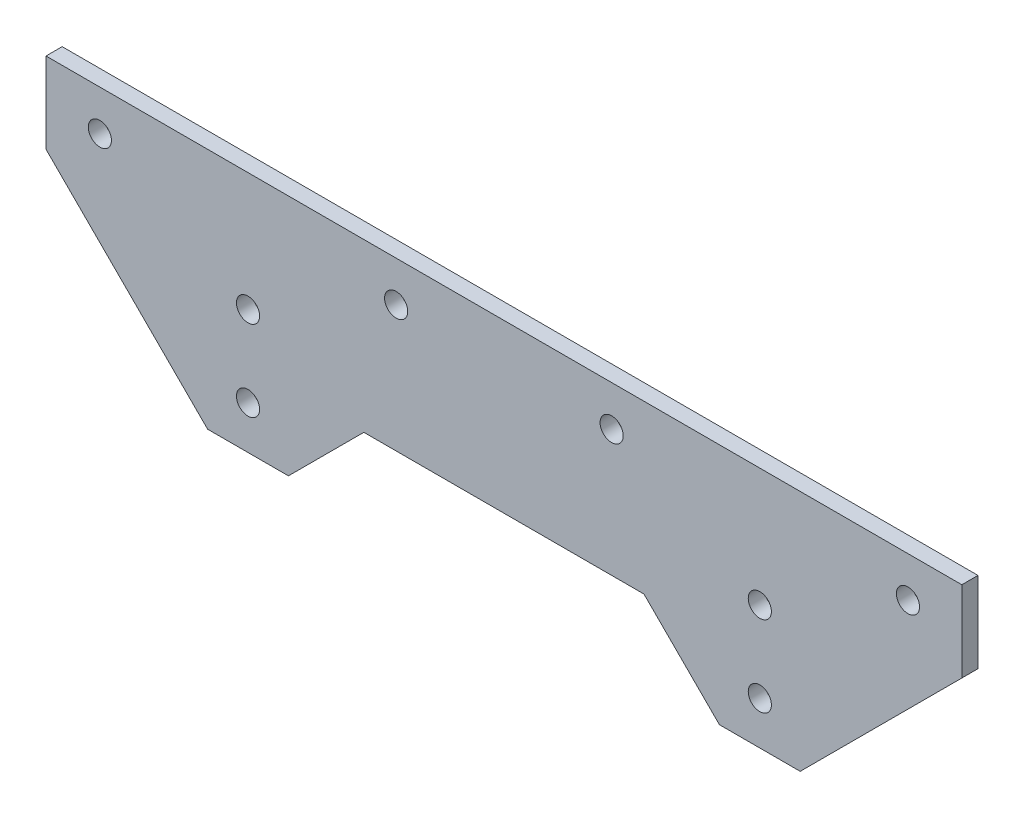
ISO-10303-21;
HEADER;
FILE_DESCRIPTION(('STEP AP214'),'2;1');
FILE_NAME('part.step','',(''),(''),'','','');
FILE_SCHEMA(('AUTOMOTIVE_DESIGN { 1 0 10303 214 1 1 1 1 }'));
ENDSEC;
DATA;
#1=APPLICATION_CONTEXT('core data for automotive mechanical design processes');
#2=APPLICATION_PROTOCOL_DEFINITION('international standard','automotive_design',2000,#1);
#3=PRODUCT_CONTEXT('',#1,'mechanical');
#4=PRODUCT('Part','Part','',(#3));
#5=PRODUCT_RELATED_PRODUCT_CATEGORY('part','',(#4));
#6=PRODUCT_DEFINITION_FORMATION('','',#4);
#7=PRODUCT_DEFINITION_CONTEXT('part definition',#1,'design');
#8=PRODUCT_DEFINITION('design','',#6,#7);
#9=PRODUCT_DEFINITION_SHAPE('','',#8);
#10=(LENGTH_UNIT() NAMED_UNIT(*) SI_UNIT(.MILLI.,.METRE.));
#11=(NAMED_UNIT(*) PLANE_ANGLE_UNIT() SI_UNIT($,.RADIAN.));
#12=(NAMED_UNIT(*) SI_UNIT($,.STERADIAN.) SOLID_ANGLE_UNIT());
#13=UNCERTAINTY_MEASURE_WITH_UNIT(LENGTH_MEASURE(1.E-05),#10,'distance_accuracy_value','');
#14=(GEOMETRIC_REPRESENTATION_CONTEXT(3) GLOBAL_UNCERTAINTY_ASSIGNED_CONTEXT((#13)) GLOBAL_UNIT_ASSIGNED_CONTEXT((#10,
#11,#12)) REPRESENTATION_CONTEXT('',''));
#15=CARTESIAN_POINT('',(0.,0.,0.));
#16=DIRECTION('',(0.,0.,1.));
#17=DIRECTION('',(1.,0.,0.));
#18=AXIS2_PLACEMENT_3D('',#15,#16,#17);
#19=CARTESIAN_POINT('',(0.,0.,3.));
#20=DIRECTION('',(0.,0.,1.));
#21=DIRECTION('',(1.,0.,0.));
#22=AXIS2_PLACEMENT_3D('',#19,#20,#21);
#23=PLANE('',#22);
#24=CARTESIAN_POINT('',(19.9999999999997,218.499923245137,3.));
#25=DIRECTION('',(0.,0.,1.));
#26=DIRECTION('',(-1.,0.,0.));
#27=AXIS2_PLACEMENT_3D('',#24,#25,#26);
#28=CIRCLE('',#27,2.15000000000001);
#29=CARTESIAN_POINT('',(17.8499999999997,218.499923245137,3.));
#30=VERTEX_POINT('',#29);
#31=EDGE_CURVE('E254',#30,#30,#28,.T.);
#32=ORIENTED_EDGE('',*,*,#31,.F.);
#33=EDGE_LOOP('',(#32));
#34=FACE_BOUND('',#33,.T.);
#35=CARTESIAN_POINT('',(47.4999999999961,188.999923245137,3.));
#36=DIRECTION('',(0.,0.,1.));
#37=DIRECTION('',(-1.,0.,0.));
#38=AXIS2_PLACEMENT_3D('',#35,#36,#37);
#39=CIRCLE('',#38,2.15000000000002);
#40=CARTESIAN_POINT('',(45.3499999999961,188.999923245137,3.));
#41=VERTEX_POINT('',#40);
#42=EDGE_CURVE('E242',#41,#41,#39,.T.);
#43=ORIENTED_EDGE('',*,*,#42,.F.);
#44=EDGE_LOOP('',(#43));
#45=FACE_BOUND('',#44,.T.);
#46=CARTESIAN_POINT('',(-74.9999999999968,218.499923245137,3.));
#47=DIRECTION('',(0.,0.,1.));
#48=DIRECTION('',(1.,0.,0.));
#49=AXIS2_PLACEMENT_3D('',#46,#47,#48);
#50=CIRCLE('',#49,2.15);
#51=CARTESIAN_POINT('',(-72.8499999999968,218.499923245137,3.));
#52=VERTEX_POINT('',#51);
#53=EDGE_CURVE('E230',#52,#52,#50,.T.);
#54=ORIENTED_EDGE('',*,*,#53,.F.);
#55=EDGE_LOOP('',(#54));
#56=FACE_BOUND('',#55,.T.);
#57=CARTESIAN_POINT('',(-47.4999999999967,188.999923245137,3.));
#58=DIRECTION('',(0.,0.,1.));
#59=DIRECTION('',(1.,0.,0.));
#60=AXIS2_PLACEMENT_3D('',#57,#58,#59);
#61=CIRCLE('',#60,2.15000000000001);
#62=CARTESIAN_POINT('',(-45.3499999999966,188.999923245137,3.));
#63=VERTEX_POINT('',#62);
#64=EDGE_CURVE('E158',#63,#63,#61,.T.);
#65=ORIENTED_EDGE('',*,*,#64,.F.);
#66=EDGE_LOOP('',(#65));
#67=FACE_BOUND('',#66,.T.);
#68=DIRECTION('',(-1.,0.,0.));
#69=VECTOR('',#68,1.);
#70=CARTESIAN_POINT('',(84.9999999999964,225.999923245137,3.));
#71=LINE('',#70,#69);
#72=CARTESIAN_POINT('',(84.9999999999964,225.999923245137,3.));
#73=VERTEX_POINT('',#72);
#74=CARTESIAN_POINT('',(-84.9999999999969,225.999923245137,3.));
#75=VERTEX_POINT('',#74);
#76=EDGE_CURVE('E173',#73,#75,#71,.T.);
#77=ORIENTED_EDGE('',*,*,#76,.T.);
#78=DIRECTION('',(0.,-1.,0.));
#79=VECTOR('',#78,1.);
#80=CARTESIAN_POINT('',(-84.9999999999969,225.999923245137,3.));
#81=LINE('',#80,#79);
#82=CARTESIAN_POINT('',(-84.9999999999968,210.999923245137,3.));
#83=VERTEX_POINT('',#82);
#84=EDGE_CURVE('E111',#75,#83,#81,.T.);
#85=ORIENTED_EDGE('',*,*,#84,.T.);
#86=DIRECTION('',(0.707106781186549,-0.707106781186545,0.));
#87=VECTOR('',#86,1.);
#88=CARTESIAN_POINT('',(-84.9999999999968,210.999923245137,3.));
#89=LINE('',#88,#87);
#90=CARTESIAN_POINT('',(-54.9999999999967,180.999923245137,3.));
#91=VERTEX_POINT('',#90);
#92=EDGE_CURVE('E194',#83,#91,#89,.T.);
#93=ORIENTED_EDGE('',*,*,#92,.T.);
#94=DIRECTION('',(1.,0.,0.));
#95=VECTOR('',#94,1.);
#96=CARTESIAN_POINT('',(-54.9999999999967,180.999923245137,3.));
#97=LINE('',#96,#95);
#98=CARTESIAN_POINT('',(-39.9999999999967,180.999923245137,3.));
#99=VERTEX_POINT('',#98);
#100=EDGE_CURVE('E213',#91,#99,#97,.T.);
#101=ORIENTED_EDGE('',*,*,#100,.T.);
#102=DIRECTION('',(0.707106781186546,0.707106781186549,0.));
#103=VECTOR('',#102,1.);
#104=CARTESIAN_POINT('',(-39.9999999999967,180.999923245137,3.));
#105=LINE('',#104,#103);
#106=CARTESIAN_POINT('',(-25.9999999999967,194.999923245137,3.));
#107=VERTEX_POINT('',#106);
#108=EDGE_CURVE('E210',#99,#107,#105,.T.);
#109=ORIENTED_EDGE('',*,*,#108,.T.);
#110=DIRECTION('',(1.,0.,0.));
#111=VECTOR('',#110,1.);
#112=CARTESIAN_POINT('',(-25.9999999999967,194.999923245137,3.));
#113=LINE('',#112,#111);
#114=CARTESIAN_POINT('',(25.9999999999962,194.999923245137,3.));
#115=VERTEX_POINT('',#114);
#116=EDGE_CURVE('E212',#107,#115,#113,.T.);
#117=ORIENTED_EDGE('',*,*,#116,.T.);
#118=DIRECTION('',(0.707106781186548,-0.707106781186548,0.));
#119=VECTOR('',#118,1.);
#120=CARTESIAN_POINT('',(25.9999999999962,194.999923245137,3.));
#121=LINE('',#120,#119);
#122=CARTESIAN_POINT('',(39.9999999999963,180.999923245137,3.));
#123=VERTEX_POINT('',#122);
#124=EDGE_CURVE('E136',#115,#123,#121,.T.);
#125=ORIENTED_EDGE('',*,*,#124,.T.);
#126=DIRECTION('',(1.,0.,0.));
#127=VECTOR('',#126,1.);
#128=CARTESIAN_POINT('',(39.9999999999963,180.999923245137,3.));
#129=LINE('',#128,#127);
#130=CARTESIAN_POINT('',(54.9999999999963,180.999923245137,3.));
#131=VERTEX_POINT('',#130);
#132=EDGE_CURVE('E130',#123,#131,#129,.T.);
#133=ORIENTED_EDGE('',*,*,#132,.T.);
#134=DIRECTION('',(0.707106781186547,0.707106781186548,0.));
#135=VECTOR('',#134,1.);
#136=CARTESIAN_POINT('',(54.9999999999963,180.999923245137,3.));
#137=LINE('',#136,#135);
#138=CARTESIAN_POINT('',(84.9999999999963,210.999923245137,3.));
#139=VERTEX_POINT('',#138);
#140=EDGE_CURVE('E134',#131,#139,#137,.T.);
#141=ORIENTED_EDGE('',*,*,#140,.T.);
#142=DIRECTION('',(0.,1.,0.));
#143=VECTOR('',#142,1.);
#144=CARTESIAN_POINT('',(84.9999999999963,210.999923245137,3.));
#145=LINE('',#144,#143);
#146=EDGE_CURVE('E62',#139,#73,#145,.T.);
#147=ORIENTED_EDGE('',*,*,#146,.T.);
#148=EDGE_LOOP('',(#77,#85,#93,#101,#109,#117,#125,#133,#141,#147));
#149=FACE_BOUND('',#148,.T.);
#150=CARTESIAN_POINT('',(-47.4999999999967,203.999923245137,3.));
#151=DIRECTION('',(0.,0.,1.));
#152=DIRECTION('',(1.,0.,0.));
#153=AXIS2_PLACEMENT_3D('',#150,#151,#152);
#154=CIRCLE('',#153,2.15000000000001);
#155=CARTESIAN_POINT('',(-45.3499999999966,203.999923245137,3.));
#156=VERTEX_POINT('',#155);
#157=EDGE_CURVE('E224',#156,#156,#154,.T.);
#158=ORIENTED_EDGE('',*,*,#157,.F.);
#159=EDGE_LOOP('',(#158));
#160=FACE_BOUND('',#159,.T.);
#161=CARTESIAN_POINT('',(-20.0000000000003,218.499923245137,3.));
#162=DIRECTION('',(0.,0.,1.));
#163=DIRECTION('',(1.,0.,0.));
#164=AXIS2_PLACEMENT_3D('',#161,#162,#163);
#165=CIRCLE('',#164,2.15);
#166=CARTESIAN_POINT('',(-17.8500000000003,218.499923245137,3.));
#167=VERTEX_POINT('',#166);
#168=EDGE_CURVE('E236',#167,#167,#165,.T.);
#169=ORIENTED_EDGE('',*,*,#168,.F.);
#170=EDGE_LOOP('',(#169));
#171=FACE_BOUND('',#170,.T.);
#172=CARTESIAN_POINT('',(47.4999999999961,203.999923245137,3.));
#173=DIRECTION('',(0.,0.,1.));
#174=DIRECTION('',(-1.,0.,0.));
#175=AXIS2_PLACEMENT_3D('',#172,#173,#174);
#176=CIRCLE('',#175,2.15);
#177=CARTESIAN_POINT('',(45.3499999999961,203.999923245137,3.));
#178=VERTEX_POINT('',#177);
#179=EDGE_CURVE('E248',#178,#178,#176,.T.);
#180=ORIENTED_EDGE('',*,*,#179,.F.);
#181=EDGE_LOOP('',(#180));
#182=FACE_BOUND('',#181,.T.);
#183=CARTESIAN_POINT('',(74.9999999999962,218.499923245137,3.));
#184=DIRECTION('',(0.,0.,1.));
#185=DIRECTION('',(-1.,0.,0.));
#186=AXIS2_PLACEMENT_3D('',#183,#184,#185);
#187=CIRCLE('',#186,2.15);
#188=CARTESIAN_POINT('',(72.8499999999962,218.499923245137,3.));
#189=VERTEX_POINT('',#188);
#190=EDGE_CURVE('E260',#189,#189,#187,.T.);
#191=ORIENTED_EDGE('',*,*,#190,.F.);
#192=EDGE_LOOP('',(#191));
#193=FACE_BOUND('',#192,.T.);
#194=ADVANCED_FACE('F45',(#34,#45,#56,#67,#149,#160,#171,#182,#193),#23,.T.);
#195=CARTESIAN_POINT('',(0.,0.,0.));
#196=DIRECTION('',(0.,0.,1.));
#197=DIRECTION('',(1.,0.,0.));
#198=AXIS2_PLACEMENT_3D('',#195,#196,#197);
#199=PLANE('',#198);
#200=DIRECTION('',(-1.,0.,0.));
#201=VECTOR('',#200,1.);
#202=CARTESIAN_POINT('',(84.9999999999964,225.999923245137,0.));
#203=LINE('',#202,#201);
#204=CARTESIAN_POINT('',(84.9999999999964,225.999923245137,0.));
#205=VERTEX_POINT('',#204);
#206=CARTESIAN_POINT('',(-84.9999999999969,225.999923245137,0.));
#207=VERTEX_POINT('',#206);
#208=EDGE_CURVE('E154',#205,#207,#203,.T.);
#209=ORIENTED_EDGE('',*,*,#208,.F.);
#210=DIRECTION('',(0.,1.,0.));
#211=VECTOR('',#210,1.);
#212=CARTESIAN_POINT('',(84.9999999999963,210.999923245137,0.));
#213=LINE('',#212,#211);
#214=CARTESIAN_POINT('',(84.9999999999963,210.999923245137,0.));
#215=VERTEX_POINT('',#214);
#216=EDGE_CURVE('E103',#215,#205,#213,.T.);
#217=ORIENTED_EDGE('',*,*,#216,.F.);
#218=DIRECTION('',(0.707106781186547,0.707106781186548,0.));
#219=VECTOR('',#218,1.);
#220=CARTESIAN_POINT('',(54.9999999999963,180.999923245137,0.));
#221=LINE('',#220,#219);
#222=CARTESIAN_POINT('',(54.9999999999963,180.999923245137,0.));
#223=VERTEX_POINT('',#222);
#224=EDGE_CURVE('E97',#223,#215,#221,.T.);
#225=ORIENTED_EDGE('',*,*,#224,.F.);
#226=DIRECTION('',(1.,0.,0.));
#227=VECTOR('',#226,1.);
#228=CARTESIAN_POINT('',(39.9999999999963,180.999923245137,0.));
#229=LINE('',#228,#227);
#230=CARTESIAN_POINT('',(39.9999999999963,180.999923245137,0.));
#231=VERTEX_POINT('',#230);
#232=EDGE_CURVE('E144',#231,#223,#229,.T.);
#233=ORIENTED_EDGE('',*,*,#232,.F.);
#234=DIRECTION('',(0.707106781186548,-0.707106781186548,0.));
#235=VECTOR('',#234,1.);
#236=CARTESIAN_POINT('',(25.9999999999962,194.999923245137,0.));
#237=LINE('',#236,#235);
#238=CARTESIAN_POINT('',(25.9999999999962,194.999923245137,0.));
#239=VERTEX_POINT('',#238);
#240=EDGE_CURVE('E168',#239,#231,#237,.T.);
#241=ORIENTED_EDGE('',*,*,#240,.F.);
#242=DIRECTION('',(1.,0.,0.));
#243=VECTOR('',#242,1.);
#244=CARTESIAN_POINT('',(-25.9999999999967,194.999923245137,0.));
#245=LINE('',#244,#243);
#246=CARTESIAN_POINT('',(-25.9999999999967,194.999923245137,0.));
#247=VERTEX_POINT('',#246);
#248=EDGE_CURVE('E166',#247,#239,#245,.T.);
#249=ORIENTED_EDGE('',*,*,#248,.F.);
#250=DIRECTION('',(0.707106781186546,0.707106781186549,0.));
#251=VECTOR('',#250,1.);
#252=CARTESIAN_POINT('',(-39.9999999999967,180.999923245137,0.));
#253=LINE('',#252,#251);
#254=CARTESIAN_POINT('',(-39.9999999999967,180.999923245137,0.));
#255=VERTEX_POINT('',#254);
#256=EDGE_CURVE('E164',#255,#247,#253,.T.);
#257=ORIENTED_EDGE('',*,*,#256,.F.);
#258=DIRECTION('',(1.,0.,0.));
#259=VECTOR('',#258,1.);
#260=CARTESIAN_POINT('',(-54.9999999999967,180.999923245137,0.));
#261=LINE('',#260,#259);
#262=CARTESIAN_POINT('',(-54.9999999999967,180.999923245137,0.));
#263=VERTEX_POINT('',#262);
#264=EDGE_CURVE('E162',#263,#255,#261,.T.);
#265=ORIENTED_EDGE('',*,*,#264,.F.);
#266=DIRECTION('',(0.707106781186549,-0.707106781186545,0.));
#267=VECTOR('',#266,1.);
#268=CARTESIAN_POINT('',(-84.9999999999968,210.999923245137,0.));
#269=LINE('',#268,#267);
#270=CARTESIAN_POINT('',(-84.9999999999968,210.999923245137,0.));
#271=VERTEX_POINT('',#270);
#272=EDGE_CURVE('E160',#271,#263,#269,.T.);
#273=ORIENTED_EDGE('',*,*,#272,.F.);
#274=DIRECTION('',(0.,-1.,0.));
#275=VECTOR('',#274,1.);
#276=CARTESIAN_POINT('',(-84.9999999999969,225.999923245137,0.));
#277=LINE('',#276,#275);
#278=EDGE_CURVE('E157',#207,#271,#277,.T.);
#279=ORIENTED_EDGE('',*,*,#278,.F.);
#280=EDGE_LOOP('',(#209,#217,#225,#233,#241,#249,#257,#265,#273,#279));
#281=FACE_BOUND('',#280,.T.);
#282=CARTESIAN_POINT('',(-47.4999999999967,188.999923245137,0.));
#283=DIRECTION('',(0.,0.,1.));
#284=DIRECTION('',(1.,0.,0.));
#285=AXIS2_PLACEMENT_3D('',#282,#283,#284);
#286=CIRCLE('',#285,2.15000000000001);
#287=CARTESIAN_POINT('',(-45.3499999999966,188.999923245137,0.));
#288=VERTEX_POINT('',#287);
#289=EDGE_CURVE('E221',#288,#288,#286,.T.);
#290=ORIENTED_EDGE('',*,*,#289,.T.);
#291=EDGE_LOOP('',(#290));
#292=FACE_BOUND('',#291,.T.);
#293=CARTESIAN_POINT('',(-47.4999999999967,203.999923245137,0.));
#294=DIRECTION('',(0.,0.,1.));
#295=DIRECTION('',(1.,0.,0.));
#296=AXIS2_PLACEMENT_3D('',#293,#294,#295);
#297=CIRCLE('',#296,2.15000000000001);
#298=CARTESIAN_POINT('',(-45.3499999999966,203.999923245137,0.));
#299=VERTEX_POINT('',#298);
#300=EDGE_CURVE('E227',#299,#299,#297,.T.);
#301=ORIENTED_EDGE('',*,*,#300,.T.);
#302=EDGE_LOOP('',(#301));
#303=FACE_BOUND('',#302,.T.);
#304=CARTESIAN_POINT('',(-74.9999999999968,218.499923245137,0.));
#305=DIRECTION('',(0.,0.,1.));
#306=DIRECTION('',(1.,0.,0.));
#307=AXIS2_PLACEMENT_3D('',#304,#305,#306);
#308=CIRCLE('',#307,2.15);
#309=CARTESIAN_POINT('',(-72.8499999999968,218.499923245137,0.));
#310=VERTEX_POINT('',#309);
#311=EDGE_CURVE('E233',#310,#310,#308,.T.);
#312=ORIENTED_EDGE('',*,*,#311,.T.);
#313=EDGE_LOOP('',(#312));
#314=FACE_BOUND('',#313,.T.);
#315=CARTESIAN_POINT('',(-20.0000000000003,218.499923245137,0.));
#316=DIRECTION('',(0.,0.,1.));
#317=DIRECTION('',(1.,0.,0.));
#318=AXIS2_PLACEMENT_3D('',#315,#316,#317);
#319=CIRCLE('',#318,2.15);
#320=CARTESIAN_POINT('',(-17.8500000000003,218.499923245137,0.));
#321=VERTEX_POINT('',#320);
#322=EDGE_CURVE('E239',#321,#321,#319,.T.);
#323=ORIENTED_EDGE('',*,*,#322,.T.);
#324=EDGE_LOOP('',(#323));
#325=FACE_BOUND('',#324,.T.);
#326=CARTESIAN_POINT('',(47.4999999999961,188.999923245137,0.));
#327=DIRECTION('',(0.,0.,1.));
#328=DIRECTION('',(-1.,0.,0.));
#329=AXIS2_PLACEMENT_3D('',#326,#327,#328);
#330=CIRCLE('',#329,2.15000000000002);
#331=CARTESIAN_POINT('',(45.3499999999961,188.999923245137,0.));
#332=VERTEX_POINT('',#331);
#333=EDGE_CURVE('E245',#332,#332,#330,.T.);
#334=ORIENTED_EDGE('',*,*,#333,.T.);
#335=EDGE_LOOP('',(#334));
#336=FACE_BOUND('',#335,.T.);
#337=CARTESIAN_POINT('',(47.4999999999961,203.999923245137,0.));
#338=DIRECTION('',(0.,0.,1.));
#339=DIRECTION('',(-1.,0.,0.));
#340=AXIS2_PLACEMENT_3D('',#337,#338,#339);
#341=CIRCLE('',#340,2.15);
#342=CARTESIAN_POINT('',(45.3499999999961,203.999923245137,0.));
#343=VERTEX_POINT('',#342);
#344=EDGE_CURVE('E251',#343,#343,#341,.T.);
#345=ORIENTED_EDGE('',*,*,#344,.T.);
#346=EDGE_LOOP('',(#345));
#347=FACE_BOUND('',#346,.T.);
#348=CARTESIAN_POINT('',(19.9999999999997,218.499923245137,0.));
#349=DIRECTION('',(0.,0.,1.));
#350=DIRECTION('',(-1.,0.,0.));
#351=AXIS2_PLACEMENT_3D('',#348,#349,#350);
#352=CIRCLE('',#351,2.15000000000001);
#353=CARTESIAN_POINT('',(17.8499999999997,218.499923245137,0.));
#354=VERTEX_POINT('',#353);
#355=EDGE_CURVE('E257',#354,#354,#352,.T.);
#356=ORIENTED_EDGE('',*,*,#355,.T.);
#357=EDGE_LOOP('',(#356));
#358=FACE_BOUND('',#357,.T.);
#359=CARTESIAN_POINT('',(74.9999999999962,218.499923245137,0.));
#360=DIRECTION('',(0.,0.,1.));
#361=DIRECTION('',(-1.,0.,0.));
#362=AXIS2_PLACEMENT_3D('',#359,#360,#361);
#363=CIRCLE('',#362,2.15);
#364=CARTESIAN_POINT('',(72.8499999999962,218.499923245137,0.));
#365=VERTEX_POINT('',#364);
#366=EDGE_CURVE('E263',#365,#365,#363,.T.);
#367=ORIENTED_EDGE('',*,*,#366,.T.);
#368=EDGE_LOOP('',(#367));
#369=FACE_BOUND('',#368,.T.);
#370=ADVANCED_FACE('F198',(#281,#292,#303,#314,#325,#336,#347,#358,#369),#199,.F.);
#371=CARTESIAN_POINT('',(84.9999999999964,225.999923245137,3.));
#372=DIRECTION('',(0.,-1.,0.));
#373=DIRECTION('',(0.,0.,-1.));
#374=AXIS2_PLACEMENT_3D('',#371,#372,#373);
#375=PLANE('',#374);
#376=ORIENTED_EDGE('',*,*,#208,.T.);
#377=DIRECTION('',(0.,0.,-1.));
#378=VECTOR('',#377,1.);
#379=CARTESIAN_POINT('',(-84.9999999999969,225.999923245137,3.));
#380=LINE('',#379,#378);
#381=EDGE_CURVE('E13',#75,#207,#380,.T.);
#382=ORIENTED_EDGE('',*,*,#381,.F.);
#383=ORIENTED_EDGE('',*,*,#76,.F.);
#384=DIRECTION('',(0.,0.,-1.));
#385=VECTOR('',#384,1.);
#386=CARTESIAN_POINT('',(84.9999999999964,225.999923245137,3.));
#387=LINE('',#386,#385);
#388=EDGE_CURVE('E150',#73,#205,#387,.T.);
#389=ORIENTED_EDGE('',*,*,#388,.T.);
#390=EDGE_LOOP('',(#376,#382,#383,#389));
#391=FACE_BOUND('',#390,.T.);
#392=ADVANCED_FACE('F47',(#391),#375,.F.);
#393=CARTESIAN_POINT('',(-84.9999999999969,225.999923245137,3.));
#394=DIRECTION('',(1.,0.,0.));
#395=DIRECTION('',(0.,1.,0.));
#396=AXIS2_PLACEMENT_3D('',#393,#394,#395);
#397=PLANE('',#396);
#398=ORIENTED_EDGE('',*,*,#278,.T.);
#399=DIRECTION('',(0.,0.,-1.));
#400=VECTOR('',#399,1.);
#401=CARTESIAN_POINT('',(-84.9999999999968,210.999923245137,3.));
#402=LINE('',#401,#400);
#403=EDGE_CURVE('E54',#83,#271,#402,.T.);
#404=ORIENTED_EDGE('',*,*,#403,.F.);
#405=ORIENTED_EDGE('',*,*,#84,.F.);
#406=ORIENTED_EDGE('',*,*,#381,.T.);
#407=EDGE_LOOP('',(#398,#404,#405,#406));
#408=FACE_BOUND('',#407,.T.);
#409=ADVANCED_FACE('F305',(#408),#397,.F.);
#410=CARTESIAN_POINT('',(-84.9999999999968,210.999923245137,3.));
#411=DIRECTION('',(0.707106781186546,0.70710678118655,0.));
#412=DIRECTION('',(-0.70710678118655,0.707106781186546,0.));
#413=AXIS2_PLACEMENT_3D('',#410,#411,#412);
#414=PLANE('',#413);
#415=ORIENTED_EDGE('',*,*,#272,.T.);
#416=DIRECTION('',(0.,0.,-1.));
#417=VECTOR('',#416,1.);
#418=CARTESIAN_POINT('',(-54.9999999999967,180.999923245137,3.));
#419=LINE('',#418,#417);
#420=EDGE_CURVE('E186',#91,#263,#419,.T.);
#421=ORIENTED_EDGE('',*,*,#420,.F.);
#422=ORIENTED_EDGE('',*,*,#92,.F.);
#423=ORIENTED_EDGE('',*,*,#403,.T.);
#424=EDGE_LOOP('',(#415,#421,#422,#423));
#425=FACE_BOUND('',#424,.T.);
#426=ADVANCED_FACE('F192',(#425),#414,.F.);
#427=CARTESIAN_POINT('',(-54.9999999999967,180.999923245137,3.));
#428=DIRECTION('',(0.,1.,0.));
#429=DIRECTION('',(0.,0.,1.));
#430=AXIS2_PLACEMENT_3D('',#427,#428,#429);
#431=PLANE('',#430);
#432=ORIENTED_EDGE('',*,*,#264,.T.);
#433=DIRECTION('',(0.,0.,-1.));
#434=VECTOR('',#433,1.);
#435=CARTESIAN_POINT('',(-39.9999999999967,180.999923245137,3.));
#436=LINE('',#435,#434);
#437=EDGE_CURVE('E183',#99,#255,#436,.T.);
#438=ORIENTED_EDGE('',*,*,#437,.F.);
#439=ORIENTED_EDGE('',*,*,#100,.F.);
#440=ORIENTED_EDGE('',*,*,#420,.T.);
#441=EDGE_LOOP('',(#432,#438,#439,#440));
#442=FACE_BOUND('',#441,.T.);
#443=ADVANCED_FACE('F204',(#442),#431,.F.);
#444=CARTESIAN_POINT('',(-39.9999999999967,180.999923245137,3.));
#445=DIRECTION('',(-0.707106781186549,0.707106781186546,0.));
#446=DIRECTION('',(-0.707106781186546,-0.707106781186549,0.));
#447=AXIS2_PLACEMENT_3D('',#444,#445,#446);
#448=PLANE('',#447);
#449=ORIENTED_EDGE('',*,*,#256,.T.);
#450=DIRECTION('',(0.,0.,-1.));
#451=VECTOR('',#450,1.);
#452=CARTESIAN_POINT('',(-25.9999999999967,194.999923245137,3.));
#453=LINE('',#452,#451);
#454=EDGE_CURVE('E180',#107,#247,#453,.T.);
#455=ORIENTED_EDGE('',*,*,#454,.F.);
#456=ORIENTED_EDGE('',*,*,#108,.F.);
#457=ORIENTED_EDGE('',*,*,#437,.T.);
#458=EDGE_LOOP('',(#449,#455,#456,#457));
#459=FACE_BOUND('',#458,.T.);
#460=ADVANCED_FACE('F208',(#459),#448,.F.);
#461=CARTESIAN_POINT('',(-25.9999999999967,194.999923245137,3.));
#462=DIRECTION('',(0.,1.,0.));
#463=DIRECTION('',(0.,0.,1.));
#464=AXIS2_PLACEMENT_3D('',#461,#462,#463);
#465=PLANE('',#464);
#466=ORIENTED_EDGE('',*,*,#248,.T.);
#467=DIRECTION('',(0.,0.,-1.));
#468=VECTOR('',#467,1.);
#469=CARTESIAN_POINT('',(25.9999999999962,194.999923245137,3.));
#470=LINE('',#469,#468);
#471=EDGE_CURVE('E177',#115,#239,#470,.T.);
#472=ORIENTED_EDGE('',*,*,#471,.F.);
#473=ORIENTED_EDGE('',*,*,#116,.F.);
#474=ORIENTED_EDGE('',*,*,#454,.T.);
#475=EDGE_LOOP('',(#466,#472,#473,#474));
#476=FACE_BOUND('',#475,.T.);
#477=ADVANCED_FACE('F295',(#476),#465,.F.);
#478=CARTESIAN_POINT('',(25.9999999999962,194.999923245137,3.));
#479=DIRECTION('',(0.707106781186547,0.707106781186547,0.));
#480=DIRECTION('',(-0.707106781186548,0.707106781186548,0.));
#481=AXIS2_PLACEMENT_3D('',#478,#479,#480);
#482=PLANE('',#481);
#483=ORIENTED_EDGE('',*,*,#240,.T.);
#484=DIRECTION('',(0.,0.,-1.));
#485=VECTOR('',#484,1.);
#486=CARTESIAN_POINT('',(39.9999999999963,180.999923245137,3.));
#487=LINE('',#486,#485);
#488=EDGE_CURVE('E145',#123,#231,#487,.T.);
#489=ORIENTED_EDGE('',*,*,#488,.F.);
#490=ORIENTED_EDGE('',*,*,#124,.F.);
#491=ORIENTED_EDGE('',*,*,#471,.T.);
#492=EDGE_LOOP('',(#483,#489,#490,#491));
#493=FACE_BOUND('',#492,.T.);
#494=ADVANCED_FACE('F292',(#493),#482,.F.);
#495=CARTESIAN_POINT('',(39.9999999999963,180.999923245137,3.));
#496=DIRECTION('',(0.,1.,0.));
#497=DIRECTION('',(0.,0.,1.));
#498=AXIS2_PLACEMENT_3D('',#495,#496,#497);
#499=PLANE('',#498);
#500=ORIENTED_EDGE('',*,*,#232,.T.);
#501=DIRECTION('',(0.,0.,-1.));
#502=VECTOR('',#501,1.);
#503=CARTESIAN_POINT('',(54.9999999999963,180.999923245137,3.));
#504=LINE('',#503,#502);
#505=EDGE_CURVE('E141',#131,#223,#504,.T.);
#506=ORIENTED_EDGE('',*,*,#505,.F.);
#507=ORIENTED_EDGE('',*,*,#132,.F.);
#508=ORIENTED_EDGE('',*,*,#488,.T.);
#509=EDGE_LOOP('',(#500,#506,#507,#508));
#510=FACE_BOUND('',#509,.T.);
#511=ADVANCED_FACE('F142',(#510),#499,.F.);
#512=CARTESIAN_POINT('',(54.9999999999963,180.999923245137,3.));
#513=DIRECTION('',(-0.707106781186548,0.707106781186547,0.));
#514=DIRECTION('',(-0.707106781186547,-0.707106781186548,0.));
#515=AXIS2_PLACEMENT_3D('',#512,#513,#514);
#516=PLANE('',#515);
#517=ORIENTED_EDGE('',*,*,#224,.T.);
#518=DIRECTION('',(0.,0.,-1.));
#519=VECTOR('',#518,1.);
#520=CARTESIAN_POINT('',(84.9999999999963,210.999923245137,3.));
#521=LINE('',#520,#519);
#522=EDGE_CURVE('E146',#139,#215,#521,.T.);
#523=ORIENTED_EDGE('',*,*,#522,.F.);
#524=ORIENTED_EDGE('',*,*,#140,.F.);
#525=ORIENTED_EDGE('',*,*,#505,.T.);
#526=EDGE_LOOP('',(#517,#523,#524,#525));
#527=FACE_BOUND('',#526,.T.);
#528=ADVANCED_FACE('F148',(#527),#516,.F.);
#529=CARTESIAN_POINT('',(84.9999999999963,210.999923245137,3.));
#530=DIRECTION('',(-1.,0.,0.));
#531=DIRECTION('',(0.,-1.,0.));
#532=AXIS2_PLACEMENT_3D('',#529,#530,#531);
#533=PLANE('',#532);
#534=ORIENTED_EDGE('',*,*,#216,.T.);
#535=ORIENTED_EDGE('',*,*,#388,.F.);
#536=ORIENTED_EDGE('',*,*,#146,.F.);
#537=ORIENTED_EDGE('',*,*,#522,.T.);
#538=EDGE_LOOP('',(#534,#535,#536,#537));
#539=FACE_BOUND('',#538,.T.);
#540=ADVANCED_FACE('F285',(#539),#533,.F.);
#541=CARTESIAN_POINT('',(-47.4999999999967,188.999923245137,3.));
#542=DIRECTION('',(0.,0.,-1.));
#543=DIRECTION('',(-1.,0.,0.));
#544=AXIS2_PLACEMENT_3D('',#541,#542,#543);
#545=CYLINDRICAL_SURFACE('',#544,2.15000000000001);
#546=ORIENTED_EDGE('',*,*,#64,.T.);
#547=EDGE_LOOP('',(#546));
#548=FACE_BOUND('',#547,.T.);
#549=ORIENTED_EDGE('',*,*,#289,.F.);
#550=EDGE_LOOP('',(#549));
#551=FACE_BOUND('',#550,.T.);
#552=ADVANCED_FACE('F282',(#548,#551),#545,.F.);
#553=CARTESIAN_POINT('',(-47.4999999999967,203.999923245137,3.));
#554=DIRECTION('',(0.,0.,-1.));
#555=DIRECTION('',(-1.,0.,0.));
#556=AXIS2_PLACEMENT_3D('',#553,#554,#555);
#557=CYLINDRICAL_SURFACE('',#556,2.15000000000001);
#558=ORIENTED_EDGE('',*,*,#157,.T.);
#559=EDGE_LOOP('',(#558));
#560=FACE_BOUND('',#559,.T.);
#561=ORIENTED_EDGE('',*,*,#300,.F.);
#562=EDGE_LOOP('',(#561));
#563=FACE_BOUND('',#562,.T.);
#564=ADVANCED_FACE('F381',(#560,#563),#557,.F.);
#565=CARTESIAN_POINT('',(-74.9999999999968,218.499923245137,3.));
#566=DIRECTION('',(0.,0.,-1.));
#567=DIRECTION('',(-1.,0.,0.));
#568=AXIS2_PLACEMENT_3D('',#565,#566,#567);
#569=CYLINDRICAL_SURFACE('',#568,2.15);
#570=ORIENTED_EDGE('',*,*,#53,.T.);
#571=EDGE_LOOP('',(#570));
#572=FACE_BOUND('',#571,.T.);
#573=ORIENTED_EDGE('',*,*,#311,.F.);
#574=EDGE_LOOP('',(#573));
#575=FACE_BOUND('',#574,.T.);
#576=ADVANCED_FACE('F389',(#572,#575),#569,.F.);
#577=CARTESIAN_POINT('',(-20.0000000000003,218.499923245137,3.));
#578=DIRECTION('',(0.,0.,-1.));
#579=DIRECTION('',(-1.,0.,0.));
#580=AXIS2_PLACEMENT_3D('',#577,#578,#579);
#581=CYLINDRICAL_SURFACE('',#580,2.15);
#582=ORIENTED_EDGE('',*,*,#168,.T.);
#583=EDGE_LOOP('',(#582));
#584=FACE_BOUND('',#583,.T.);
#585=ORIENTED_EDGE('',*,*,#322,.F.);
#586=EDGE_LOOP('',(#585));
#587=FACE_BOUND('',#586,.T.);
#588=ADVANCED_FACE('F397',(#584,#587),#581,.F.);
#589=CARTESIAN_POINT('',(47.4999999999961,188.999923245137,3.));
#590=DIRECTION('',(0.,0.,-1.));
#591=DIRECTION('',(-1.,0.,0.));
#592=AXIS2_PLACEMENT_3D('',#589,#590,#591);
#593=CYLINDRICAL_SURFACE('',#592,2.15000000000002);
#594=ORIENTED_EDGE('',*,*,#42,.T.);
#595=EDGE_LOOP('',(#594));
#596=FACE_BOUND('',#595,.T.);
#597=ORIENTED_EDGE('',*,*,#333,.F.);
#598=EDGE_LOOP('',(#597));
#599=FACE_BOUND('',#598,.T.);
#600=ADVANCED_FACE('F406',(#596,#599),#593,.F.);
#601=CARTESIAN_POINT('',(47.4999999999961,203.999923245137,3.));
#602=DIRECTION('',(0.,0.,-1.));
#603=DIRECTION('',(-1.,0.,0.));
#604=AXIS2_PLACEMENT_3D('',#601,#602,#603);
#605=CYLINDRICAL_SURFACE('',#604,2.15);
#606=ORIENTED_EDGE('',*,*,#179,.T.);
#607=EDGE_LOOP('',(#606));
#608=FACE_BOUND('',#607,.T.);
#609=ORIENTED_EDGE('',*,*,#344,.F.);
#610=EDGE_LOOP('',(#609));
#611=FACE_BOUND('',#610,.T.);
#612=ADVANCED_FACE('F415',(#608,#611),#605,.F.);
#613=CARTESIAN_POINT('',(19.9999999999997,218.499923245137,3.));
#614=DIRECTION('',(0.,0.,-1.));
#615=DIRECTION('',(-1.,0.,0.));
#616=AXIS2_PLACEMENT_3D('',#613,#614,#615);
#617=CYLINDRICAL_SURFACE('',#616,2.15000000000001);
#618=ORIENTED_EDGE('',*,*,#31,.T.);
#619=EDGE_LOOP('',(#618));
#620=FACE_BOUND('',#619,.T.);
#621=ORIENTED_EDGE('',*,*,#355,.F.);
#622=EDGE_LOOP('',(#621));
#623=FACE_BOUND('',#622,.T.);
#624=ADVANCED_FACE('F424',(#620,#623),#617,.F.);
#625=CARTESIAN_POINT('',(74.9999999999962,218.499923245137,3.));
#626=DIRECTION('',(0.,0.,-1.));
#627=DIRECTION('',(-1.,0.,0.));
#628=AXIS2_PLACEMENT_3D('',#625,#626,#627);
#629=CYLINDRICAL_SURFACE('',#628,2.15);
#630=ORIENTED_EDGE('',*,*,#190,.T.);
#631=EDGE_LOOP('',(#630));
#632=FACE_BOUND('',#631,.T.);
#633=ORIENTED_EDGE('',*,*,#366,.F.);
#634=EDGE_LOOP('',(#633));
#635=FACE_BOUND('',#634,.T.);
#636=ADVANCED_FACE('F269',(#632,#635),#629,.F.);
#637=CLOSED_SHELL('',(#194,#370,#392,#409,#426,#443,#460,#477,#494,#511,#528,#540,#552,#564,
#576,#588,#600,#612,#624,#636));
#638=MANIFOLD_SOLID_BREP('B2',#637);
#639=ADVANCED_BREP_SHAPE_REPRESENTATION('',(#18,#638),#14);
#640=SHAPE_DEFINITION_REPRESENTATION(#9,#639);
ENDSEC;
END-ISO-10303-21;
